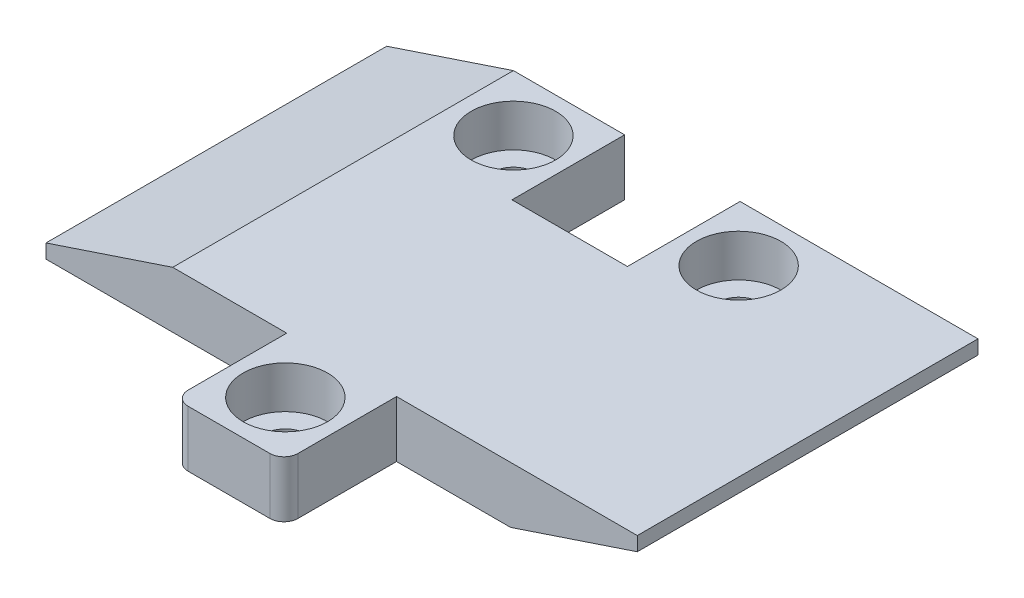
ISO-10303-21;
HEADER;
FILE_DESCRIPTION(('STEP AP214'),'2;1');
FILE_NAME('part.step','',(''),(''),'','','');
FILE_SCHEMA(('AUTOMOTIVE_DESIGN { 1 0 10303 214 1 1 1 1 }'));
ENDSEC;
DATA;
#1=APPLICATION_CONTEXT('core data for automotive mechanical design processes');
#2=APPLICATION_PROTOCOL_DEFINITION('international standard','automotive_design',2000,#1);
#3=PRODUCT_CONTEXT('',#1,'mechanical');
#4=PRODUCT('Part','Part','',(#3));
#5=PRODUCT_RELATED_PRODUCT_CATEGORY('part','',(#4));
#6=PRODUCT_DEFINITION_FORMATION('','',#4);
#7=PRODUCT_DEFINITION_CONTEXT('part definition',#1,'design');
#8=PRODUCT_DEFINITION('design','',#6,#7);
#9=PRODUCT_DEFINITION_SHAPE('','',#8);
#10=(LENGTH_UNIT() NAMED_UNIT(*) SI_UNIT(.MILLI.,.METRE.));
#11=(NAMED_UNIT(*) PLANE_ANGLE_UNIT() SI_UNIT($,.RADIAN.));
#12=(NAMED_UNIT(*) SI_UNIT($,.STERADIAN.) SOLID_ANGLE_UNIT());
#13=UNCERTAINTY_MEASURE_WITH_UNIT(LENGTH_MEASURE(1.E-05),#10,'distance_accuracy_value','');
#14=(GEOMETRIC_REPRESENTATION_CONTEXT(3) GLOBAL_UNCERTAINTY_ASSIGNED_CONTEXT((#13)) GLOBAL_UNIT_ASSIGNED_CONTEXT((#10,
#11,#12)) REPRESENTATION_CONTEXT('',''));
#15=CARTESIAN_POINT('',(0.,0.,0.));
#16=DIRECTION('',(0.,0.,1.));
#17=DIRECTION('',(1.,0.,0.));
#18=AXIS2_PLACEMENT_3D('',#15,#16,#17);
#19=CARTESIAN_POINT('',(0.,4.,12.1));
#20=DIRECTION('',(0.,-1.,0.));
#21=DIRECTION('',(0.,0.,-1.));
#22=AXIS2_PLACEMENT_3D('',#19,#20,#21);
#23=CYLINDRICAL_SURFACE('',#22,1.5);
#24=CARTESIAN_POINT('',(0.,0.,12.1));
#25=DIRECTION('',(0.,1.,0.));
#26=DIRECTION('',(0.,0.,1.));
#27=AXIS2_PLACEMENT_3D('',#24,#25,#26);
#28=CIRCLE('',#27,1.5);
#29=CARTESIAN_POINT('',(0.,0.,13.6));
#30=VERTEX_POINT('',#29);
#31=EDGE_CURVE('E259',#30,#30,#28,.T.);
#32=ORIENTED_EDGE('',*,*,#31,.F.);
#33=EDGE_LOOP('',(#32));
#34=FACE_BOUND('',#33,.T.);
#35=CARTESIAN_POINT('',(0.,1.,12.1));
#36=DIRECTION('',(0.,1.,0.));
#37=DIRECTION('',(0.,0.,1.));
#38=AXIS2_PLACEMENT_3D('',#35,#36,#37);
#39=CIRCLE('',#38,1.5);
#40=CARTESIAN_POINT('',(0.,1.,13.6));
#41=VERTEX_POINT('',#40);
#42=EDGE_CURVE('E256',#41,#41,#39,.T.);
#43=ORIENTED_EDGE('',*,*,#42,.T.);
#44=EDGE_LOOP('',(#43));
#45=FACE_BOUND('',#44,.T.);
#46=ADVANCED_FACE('F42',(#34,#45),#23,.F.);
#47=CARTESIAN_POINT('',(8.,4.,-12.1));
#48=DIRECTION('',(0.,-1.,0.));
#49=DIRECTION('',(0.,0.,-1.));
#50=AXIS2_PLACEMENT_3D('',#47,#48,#49);
#51=CYLINDRICAL_SURFACE('',#50,1.5);
#52=CARTESIAN_POINT('',(8.,0.,-12.1));
#53=DIRECTION('',(0.,1.,0.));
#54=DIRECTION('',(0.,0.,1.));
#55=AXIS2_PLACEMENT_3D('',#52,#53,#54);
#56=CIRCLE('',#55,1.5);
#57=CARTESIAN_POINT('',(8.,0.,-10.6));
#58=VERTEX_POINT('',#57);
#59=EDGE_CURVE('E348',#58,#58,#56,.T.);
#60=ORIENTED_EDGE('',*,*,#59,.F.);
#61=EDGE_LOOP('',(#60));
#62=FACE_BOUND('',#61,.T.);
#63=CARTESIAN_POINT('',(8.,1.,-12.1));
#64=DIRECTION('',(0.,1.,0.));
#65=DIRECTION('',(0.,0.,1.));
#66=AXIS2_PLACEMENT_3D('',#63,#64,#65);
#67=CIRCLE('',#66,1.5);
#68=CARTESIAN_POINT('',(8.,1.,-10.6));
#69=VERTEX_POINT('',#68);
#70=EDGE_CURVE('E251',#69,#69,#67,.T.);
#71=ORIENTED_EDGE('',*,*,#70,.T.);
#72=EDGE_LOOP('',(#71));
#73=FACE_BOUND('',#72,.T.);
#74=ADVANCED_FACE('F436',(#62,#73),#51,.F.);
#75=CARTESIAN_POINT('',(-8.,4.,-12.1));
#76=DIRECTION('',(0.,-1.,0.));
#77=DIRECTION('',(0.,0.,-1.));
#78=AXIS2_PLACEMENT_3D('',#75,#76,#77);
#79=CYLINDRICAL_SURFACE('',#78,1.5);
#80=CARTESIAN_POINT('',(-8.,0.,-12.1));
#81=DIRECTION('',(0.,1.,0.));
#82=DIRECTION('',(0.,0.,1.));
#83=AXIS2_PLACEMENT_3D('',#80,#81,#82);
#84=CIRCLE('',#83,1.5);
#85=CARTESIAN_POINT('',(-8.,0.,-10.6));
#86=VERTEX_POINT('',#85);
#87=EDGE_CURVE('E317',#86,#86,#84,.T.);
#88=ORIENTED_EDGE('',*,*,#87,.F.);
#89=EDGE_LOOP('',(#88));
#90=FACE_BOUND('',#89,.T.);
#91=CARTESIAN_POINT('',(-8.,1.,-12.1));
#92=DIRECTION('',(0.,1.,0.));
#93=DIRECTION('',(0.,0.,1.));
#94=AXIS2_PLACEMENT_3D('',#91,#92,#93);
#95=CIRCLE('',#94,1.5);
#96=CARTESIAN_POINT('',(-8.,1.,-10.6));
#97=VERTEX_POINT('',#96);
#98=EDGE_CURVE('E247',#97,#97,#95,.T.);
#99=ORIENTED_EDGE('',*,*,#98,.T.);
#100=EDGE_LOOP('',(#99));
#101=FACE_BOUND('',#100,.T.);
#102=ADVANCED_FACE('F442',(#90,#101),#79,.F.);
#103=CARTESIAN_POINT('',(-21.,4.,8.1));
#104=DIRECTION('',(1.,0.,0.));
#105=DIRECTION('',(0.,0.,-1.));
#106=AXIS2_PLACEMENT_3D('',#103,#104,#105);
#107=PLANE('',#106);
#108=DIRECTION('',(0.,-1.,0.));
#109=VECTOR('',#108,1.);
#110=CARTESIAN_POINT('',(-21.,4.,8.1));
#111=LINE('',#110,#109);
#112=CARTESIAN_POINT('',(-21.,1.,8.1));
#113=VERTEX_POINT('',#112);
#114=CARTESIAN_POINT('',(-21.,0.,8.1));
#115=VERTEX_POINT('',#114);
#116=EDGE_CURVE('E170',#113,#115,#111,.T.);
#117=ORIENTED_EDGE('',*,*,#116,.F.);
#118=DIRECTION('',(0.,0.,-1.));
#119=VECTOR('',#118,1.);
#120=CARTESIAN_POINT('',(-21.,1.,16.1));
#121=LINE('',#120,#119);
#122=CARTESIAN_POINT('',(-21.,1.,-16.1));
#123=VERTEX_POINT('',#122);
#124=EDGE_CURVE('E386',#113,#123,#121,.T.);
#125=ORIENTED_EDGE('',*,*,#124,.T.);
#126=DIRECTION('',(0.,-1.,0.));
#127=VECTOR('',#126,1.);
#128=CARTESIAN_POINT('',(-21.,4.,-16.1));
#129=LINE('',#128,#127);
#130=CARTESIAN_POINT('',(-21.,0.,-16.1));
#131=VERTEX_POINT('',#130);
#132=EDGE_CURVE('E212',#123,#131,#129,.T.);
#133=ORIENTED_EDGE('',*,*,#132,.T.);
#134=DIRECTION('',(0.,0.,1.));
#135=VECTOR('',#134,1.);
#136=CARTESIAN_POINT('',(-21.,0.,8.1));
#137=LINE('',#136,#135);
#138=EDGE_CURVE('E313',#131,#115,#137,.T.);
#139=ORIENTED_EDGE('',*,*,#138,.T.);
#140=EDGE_LOOP('',(#117,#125,#133,#139));
#141=FACE_BOUND('',#140,.T.);
#142=ADVANCED_FACE('F420',(#141),#107,.F.);
#143=CARTESIAN_POINT('',(-3.9,4.,8.1));
#144=DIRECTION('',(0.,0.,-1.));
#145=DIRECTION('',(-1.,0.,0.));
#146=AXIS2_PLACEMENT_3D('',#143,#144,#145);
#147=PLANE('',#146);
#148=DIRECTION('',(1.,0.,0.));
#149=VECTOR('',#148,1.);
#150=CARTESIAN_POINT('',(-3.9,4.,8.1));
#151=LINE('',#150,#149);
#152=CARTESIAN_POINT('',(-12.,4.,8.1));
#153=VERTEX_POINT('',#152);
#154=CARTESIAN_POINT('',(-3.9,4.,8.1));
#155=VERTEX_POINT('',#154);
#156=EDGE_CURVE('E211',#153,#155,#151,.T.);
#157=ORIENTED_EDGE('',*,*,#156,.F.);
#158=DIRECTION('',(-0.948683298050514,-0.316227766016838,0.));
#159=VECTOR('',#158,1.);
#160=CARTESIAN_POINT('',(-4.71,6.43,8.1));
#161=LINE('',#160,#159);
#162=EDGE_CURVE('E360',#153,#113,#161,.T.);
#163=ORIENTED_EDGE('',*,*,#162,.T.);
#164=ORIENTED_EDGE('',*,*,#116,.T.);
#165=DIRECTION('',(1.,0.,0.));
#166=VECTOR('',#165,1.);
#167=CARTESIAN_POINT('',(-3.9,0.,8.1));
#168=LINE('',#167,#166);
#169=CARTESIAN_POINT('',(-3.9,0.,8.1));
#170=VERTEX_POINT('',#169);
#171=EDGE_CURVE('E308',#115,#170,#168,.T.);
#172=ORIENTED_EDGE('',*,*,#171,.T.);
#173=DIRECTION('',(0.,-1.,0.));
#174=VECTOR('',#173,1.);
#175=CARTESIAN_POINT('',(-3.9,4.,8.1));
#176=LINE('',#175,#174);
#177=EDGE_CURVE('E241',#155,#170,#176,.T.);
#178=ORIENTED_EDGE('',*,*,#177,.F.);
#179=EDGE_LOOP('',(#157,#163,#164,#172,#178));
#180=FACE_BOUND('',#179,.T.);
#181=ADVANCED_FACE('F425',(#180),#147,.F.);
#182=CARTESIAN_POINT('',(-3.9,4.,16.1));
#183=DIRECTION('',(1.,0.,0.));
#184=DIRECTION('',(0.,0.,-1.));
#185=AXIS2_PLACEMENT_3D('',#182,#183,#184);
#186=PLANE('',#185);
#187=DIRECTION('',(0.,0.,1.));
#188=VECTOR('',#187,1.);
#189=CARTESIAN_POINT('',(-3.9,0.,16.1));
#190=LINE('',#189,#188);
#191=CARTESIAN_POINT('',(-3.9,0.,15.1));
#192=VERTEX_POINT('',#191);
#193=EDGE_CURVE('E304',#170,#192,#190,.T.);
#194=ORIENTED_EDGE('',*,*,#193,.T.);
#195=DIRECTION('',(0.,-1.,0.));
#196=VECTOR('',#195,1.);
#197=CARTESIAN_POINT('',(-3.9,4.,15.1));
#198=LINE('',#197,#196);
#199=CARTESIAN_POINT('',(-3.9,4.,15.1));
#200=VERTEX_POINT('',#199);
#201=EDGE_CURVE('E11',#192,#200,#198,.F.);
#202=ORIENTED_EDGE('',*,*,#201,.T.);
#203=DIRECTION('',(0.,0.,1.));
#204=VECTOR('',#203,1.);
#205=CARTESIAN_POINT('',(-3.9,4.,16.1));
#206=LINE('',#205,#204);
#207=EDGE_CURVE('E340',#155,#200,#206,.T.);
#208=ORIENTED_EDGE('',*,*,#207,.F.);
#209=ORIENTED_EDGE('',*,*,#177,.T.);
#210=EDGE_LOOP('',(#194,#202,#208,#209));
#211=FACE_BOUND('',#210,.T.);
#212=ADVANCED_FACE('F428',(#211),#186,.F.);
#213=CARTESIAN_POINT('',(3.9,4.,16.1));
#214=DIRECTION('',(0.,0.,-1.));
#215=DIRECTION('',(-1.,0.,0.));
#216=AXIS2_PLACEMENT_3D('',#213,#214,#215);
#217=PLANE('',#216);
#218=DIRECTION('',(1.,0.,0.));
#219=VECTOR('',#218,1.);
#220=CARTESIAN_POINT('',(3.9,0.,16.1));
#221=LINE('',#220,#219);
#222=CARTESIAN_POINT('',(-2.9,0.,16.1));
#223=VERTEX_POINT('',#222);
#224=CARTESIAN_POINT('',(2.9,0.,16.1));
#225=VERTEX_POINT('',#224);
#226=EDGE_CURVE('E300',#223,#225,#221,.T.);
#227=ORIENTED_EDGE('',*,*,#226,.T.);
#228=DIRECTION('',(0.,-1.,0.));
#229=VECTOR('',#228,1.);
#230=CARTESIAN_POINT('',(2.9,4.,16.1));
#231=LINE('',#230,#229);
#232=CARTESIAN_POINT('',(2.9,4.,16.1));
#233=VERTEX_POINT('',#232);
#234=EDGE_CURVE('E64',#225,#233,#231,.F.);
#235=ORIENTED_EDGE('',*,*,#234,.T.);
#236=DIRECTION('',(1.,0.,0.));
#237=VECTOR('',#236,1.);
#238=CARTESIAN_POINT('',(3.9,4.,16.1));
#239=LINE('',#238,#237);
#240=CARTESIAN_POINT('',(-2.9,4.,16.1));
#241=VERTEX_POINT('',#240);
#242=EDGE_CURVE('E289',#241,#233,#239,.T.);
#243=ORIENTED_EDGE('',*,*,#242,.F.);
#244=DIRECTION('',(0.,-1.,0.));
#245=VECTOR('',#244,1.);
#246=CARTESIAN_POINT('',(-2.9,4.,16.1));
#247=LINE('',#246,#245);
#248=EDGE_CURVE('E274',#241,#223,#247,.T.);
#249=ORIENTED_EDGE('',*,*,#248,.T.);
#250=EDGE_LOOP('',(#227,#235,#243,#249));
#251=FACE_BOUND('',#250,.T.);
#252=ADVANCED_FACE('F301',(#251),#217,.F.);
#253=CARTESIAN_POINT('',(3.9,4.,8.1));
#254=DIRECTION('',(-1.,0.,0.));
#255=DIRECTION('',(0.,0.,1.));
#256=AXIS2_PLACEMENT_3D('',#253,#254,#255);
#257=PLANE('',#256);
#258=DIRECTION('',(0.,0.,-1.));
#259=VECTOR('',#258,1.);
#260=CARTESIAN_POINT('',(3.9,4.,8.1));
#261=LINE('',#260,#259);
#262=CARTESIAN_POINT('',(3.9,4.,15.1));
#263=VERTEX_POINT('',#262);
#264=CARTESIAN_POINT('',(3.9,4.,8.1));
#265=VERTEX_POINT('',#264);
#266=EDGE_CURVE('E287',#263,#265,#261,.T.);
#267=ORIENTED_EDGE('',*,*,#266,.F.);
#268=DIRECTION('',(0.,-1.,0.));
#269=VECTOR('',#268,1.);
#270=CARTESIAN_POINT('',(3.9,4.,15.1));
#271=LINE('',#270,#269);
#272=CARTESIAN_POINT('',(3.9,0.,15.1));
#273=VERTEX_POINT('',#272);
#274=EDGE_CURVE('E264',#263,#273,#271,.T.);
#275=ORIENTED_EDGE('',*,*,#274,.T.);
#276=DIRECTION('',(0.,0.,-1.));
#277=VECTOR('',#276,1.);
#278=CARTESIAN_POINT('',(3.9,0.,8.1));
#279=LINE('',#278,#277);
#280=CARTESIAN_POINT('',(3.9,0.,8.1));
#281=VERTEX_POINT('',#280);
#282=EDGE_CURVE('E198',#273,#281,#279,.T.);
#283=ORIENTED_EDGE('',*,*,#282,.T.);
#284=DIRECTION('',(0.,-1.,0.));
#285=VECTOR('',#284,1.);
#286=CARTESIAN_POINT('',(3.9,4.,8.1));
#287=LINE('',#286,#285);
#288=EDGE_CURVE('E237',#265,#281,#287,.T.);
#289=ORIENTED_EDGE('',*,*,#288,.F.);
#290=EDGE_LOOP('',(#267,#275,#283,#289));
#291=FACE_BOUND('',#290,.T.);
#292=ADVANCED_FACE('F293',(#291),#257,.F.);
#293=CARTESIAN_POINT('',(21.,4.,8.1));
#294=DIRECTION('',(0.,0.,-1.));
#295=DIRECTION('',(-1.,0.,0.));
#296=AXIS2_PLACEMENT_3D('',#293,#294,#295);
#297=PLANE('',#296);
#298=DIRECTION('',(1.,0.,0.));
#299=VECTOR('',#298,1.);
#300=CARTESIAN_POINT('',(21.,0.,8.1));
#301=LINE('',#300,#299);
#302=CARTESIAN_POINT('',(12.,0.,8.1));
#303=VERTEX_POINT('',#302);
#304=EDGE_CURVE('E192',#281,#303,#301,.T.);
#305=ORIENTED_EDGE('',*,*,#304,.T.);
#306=DIRECTION('',(0.948683298050514,0.316227766016838,0.));
#307=VECTOR('',#306,1.);
#308=CARTESIAN_POINT('',(21.3,3.1,8.1));
#309=LINE('',#308,#307);
#310=CARTESIAN_POINT('',(21.,3.,8.1));
#311=VERTEX_POINT('',#310);
#312=EDGE_CURVE('E163',#303,#311,#309,.T.);
#313=ORIENTED_EDGE('',*,*,#312,.T.);
#314=DIRECTION('',(0.,-1.,0.));
#315=VECTOR('',#314,1.);
#316=CARTESIAN_POINT('',(21.,4.,8.1));
#317=LINE('',#316,#315);
#318=CARTESIAN_POINT('',(21.,4.,8.1));
#319=VERTEX_POINT('',#318);
#320=EDGE_CURVE('E233',#319,#311,#317,.T.);
#321=ORIENTED_EDGE('',*,*,#320,.F.);
#322=DIRECTION('',(1.,0.,0.));
#323=VECTOR('',#322,1.);
#324=CARTESIAN_POINT('',(21.,4.,8.1));
#325=LINE('',#324,#323);
#326=EDGE_CURVE('E296',#265,#319,#325,.T.);
#327=ORIENTED_EDGE('',*,*,#326,.F.);
#328=ORIENTED_EDGE('',*,*,#288,.T.);
#329=EDGE_LOOP('',(#305,#313,#321,#327,#328));
#330=FACE_BOUND('',#329,.T.);
#331=ADVANCED_FACE('F396',(#330),#297,.F.);
#332=CARTESIAN_POINT('',(21.,4.,-16.1));
#333=DIRECTION('',(-1.,0.,0.));
#334=DIRECTION('',(0.,0.,1.));
#335=AXIS2_PLACEMENT_3D('',#332,#333,#334);
#336=PLANE('',#335);
#337=ORIENTED_EDGE('',*,*,#320,.T.);
#338=DIRECTION('',(0.,0.,-1.));
#339=VECTOR('',#338,1.);
#340=CARTESIAN_POINT('',(21.,3.,16.1));
#341=LINE('',#340,#339);
#342=CARTESIAN_POINT('',(21.,3.,-16.1));
#343=VERTEX_POINT('',#342);
#344=EDGE_CURVE('E182',#311,#343,#341,.T.);
#345=ORIENTED_EDGE('',*,*,#344,.T.);
#346=DIRECTION('',(0.,-1.,0.));
#347=VECTOR('',#346,1.);
#348=CARTESIAN_POINT('',(21.,4.,-16.1));
#349=LINE('',#348,#347);
#350=CARTESIAN_POINT('',(21.,4.,-16.1));
#351=VERTEX_POINT('',#350);
#352=EDGE_CURVE('E180',#351,#343,#349,.T.);
#353=ORIENTED_EDGE('',*,*,#352,.F.);
#354=DIRECTION('',(0.,0.,-1.));
#355=VECTOR('',#354,1.);
#356=CARTESIAN_POINT('',(21.,4.,-16.1));
#357=LINE('',#356,#355);
#358=EDGE_CURVE('E333',#319,#351,#357,.T.);
#359=ORIENTED_EDGE('',*,*,#358,.F.);
#360=EDGE_LOOP('',(#337,#345,#353,#359));
#361=FACE_BOUND('',#360,.T.);
#362=ADVANCED_FACE('F392',(#361),#336,.F.);
#363=CARTESIAN_POINT('',(4.1,4.,-16.1));
#364=DIRECTION('',(0.,0.,1.));
#365=DIRECTION('',(1.,0.,0.));
#366=AXIS2_PLACEMENT_3D('',#363,#364,#365);
#367=PLANE('',#366);
#368=ORIENTED_EDGE('',*,*,#352,.T.);
#369=DIRECTION('',(0.948683298050514,0.316227766016838,0.));
#370=VECTOR('',#369,1.);
#371=CARTESIAN_POINT('',(21.,3.,-16.1));
#372=LINE('',#371,#370);
#373=CARTESIAN_POINT('',(12.,0.,-16.1));
#374=VERTEX_POINT('',#373);
#375=EDGE_CURVE('E160',#374,#343,#372,.T.);
#376=ORIENTED_EDGE('',*,*,#375,.F.);
#377=DIRECTION('',(-1.,0.,0.));
#378=VECTOR('',#377,1.);
#379=CARTESIAN_POINT('',(4.1,0.,-16.1));
#380=LINE('',#379,#378);
#381=CARTESIAN_POINT('',(4.1,0.,-16.1));
#382=VERTEX_POINT('',#381);
#383=EDGE_CURVE('E176',#374,#382,#380,.T.);
#384=ORIENTED_EDGE('',*,*,#383,.T.);
#385=DIRECTION('',(0.,-1.,0.));
#386=VECTOR('',#385,1.);
#387=CARTESIAN_POINT('',(4.1,4.,-16.1));
#388=LINE('',#387,#386);
#389=CARTESIAN_POINT('',(4.1,4.,-16.1));
#390=VERTEX_POINT('',#389);
#391=EDGE_CURVE('E228',#390,#382,#388,.T.);
#392=ORIENTED_EDGE('',*,*,#391,.F.);
#393=DIRECTION('',(-1.,0.,0.));
#394=VECTOR('',#393,1.);
#395=CARTESIAN_POINT('',(4.1,4.,-16.1));
#396=LINE('',#395,#394);
#397=EDGE_CURVE('E330',#351,#390,#396,.T.);
#398=ORIENTED_EDGE('',*,*,#397,.F.);
#399=EDGE_LOOP('',(#368,#376,#384,#392,#398));
#400=FACE_BOUND('',#399,.T.);
#401=ADVANCED_FACE('F174',(#400),#367,.F.);
#402=CARTESIAN_POINT('',(4.1,4.,-8.1));
#403=DIRECTION('',(1.,0.,0.));
#404=DIRECTION('',(0.,0.,-1.));
#405=AXIS2_PLACEMENT_3D('',#402,#403,#404);
#406=PLANE('',#405);
#407=DIRECTION('',(0.,0.,1.));
#408=VECTOR('',#407,1.);
#409=CARTESIAN_POINT('',(4.1,0.,-8.1));
#410=LINE('',#409,#408);
#411=CARTESIAN_POINT('',(4.1,0.,-8.1));
#412=VERTEX_POINT('',#411);
#413=EDGE_CURVE('E190',#382,#412,#410,.T.);
#414=ORIENTED_EDGE('',*,*,#413,.T.);
#415=DIRECTION('',(0.,-1.,0.));
#416=VECTOR('',#415,1.);
#417=CARTESIAN_POINT('',(4.1,4.,-8.1));
#418=LINE('',#417,#416);
#419=CARTESIAN_POINT('',(4.1,4.,-8.1));
#420=VERTEX_POINT('',#419);
#421=EDGE_CURVE('E224',#420,#412,#418,.T.);
#422=ORIENTED_EDGE('',*,*,#421,.F.);
#423=DIRECTION('',(0.,0.,1.));
#424=VECTOR('',#423,1.);
#425=CARTESIAN_POINT('',(4.1,4.,-8.1));
#426=LINE('',#425,#424);
#427=EDGE_CURVE('E327',#390,#420,#426,.T.);
#428=ORIENTED_EDGE('',*,*,#427,.F.);
#429=ORIENTED_EDGE('',*,*,#391,.T.);
#430=EDGE_LOOP('',(#414,#422,#428,#429));
#431=FACE_BOUND('',#430,.T.);
#432=ADVANCED_FACE('F400',(#431),#406,.F.);
#433=CARTESIAN_POINT('',(-4.1,4.,-8.1));
#434=DIRECTION('',(0.,0.,1.));
#435=DIRECTION('',(1.,0.,0.));
#436=AXIS2_PLACEMENT_3D('',#433,#434,#435);
#437=PLANE('',#436);
#438=DIRECTION('',(-1.,0.,0.));
#439=VECTOR('',#438,1.);
#440=CARTESIAN_POINT('',(-4.1,0.,-8.1));
#441=LINE('',#440,#439);
#442=CARTESIAN_POINT('',(-4.1,0.,-8.1));
#443=VERTEX_POINT('',#442);
#444=EDGE_CURVE('E196',#412,#443,#441,.T.);
#445=ORIENTED_EDGE('',*,*,#444,.T.);
#446=DIRECTION('',(0.,-1.,0.));
#447=VECTOR('',#446,1.);
#448=CARTESIAN_POINT('',(-4.1,4.,-8.1));
#449=LINE('',#448,#447);
#450=CARTESIAN_POINT('',(-4.1,4.,-8.1));
#451=VERTEX_POINT('',#450);
#452=EDGE_CURVE('E220',#451,#443,#449,.T.);
#453=ORIENTED_EDGE('',*,*,#452,.F.);
#454=DIRECTION('',(-1.,0.,0.));
#455=VECTOR('',#454,1.);
#456=CARTESIAN_POINT('',(-4.1,4.,-8.1));
#457=LINE('',#456,#455);
#458=EDGE_CURVE('E324',#420,#451,#457,.T.);
#459=ORIENTED_EDGE('',*,*,#458,.F.);
#460=ORIENTED_EDGE('',*,*,#421,.T.);
#461=EDGE_LOOP('',(#445,#453,#459,#460));
#462=FACE_BOUND('',#461,.T.);
#463=ADVANCED_FACE('F404',(#462),#437,.F.);
#464=CARTESIAN_POINT('',(-4.1,4.,-16.1));
#465=DIRECTION('',(-1.,0.,0.));
#466=DIRECTION('',(0.,0.,1.));
#467=AXIS2_PLACEMENT_3D('',#464,#465,#466);
#468=PLANE('',#467);
#469=DIRECTION('',(0.,0.,-1.));
#470=VECTOR('',#469,1.);
#471=CARTESIAN_POINT('',(-4.1,0.,-16.1));
#472=LINE('',#471,#470);
#473=CARTESIAN_POINT('',(-4.1,0.,-16.1));
#474=VERTEX_POINT('',#473);
#475=EDGE_CURVE('E204',#443,#474,#472,.T.);
#476=ORIENTED_EDGE('',*,*,#475,.T.);
#477=DIRECTION('',(0.,-1.,0.));
#478=VECTOR('',#477,1.);
#479=CARTESIAN_POINT('',(-4.1,4.,-16.1));
#480=LINE('',#479,#478);
#481=CARTESIAN_POINT('',(-4.1,4.,-16.1));
#482=VERTEX_POINT('',#481);
#483=EDGE_CURVE('E215',#482,#474,#480,.T.);
#484=ORIENTED_EDGE('',*,*,#483,.F.);
#485=DIRECTION('',(0.,0.,-1.));
#486=VECTOR('',#485,1.);
#487=CARTESIAN_POINT('',(-4.1,4.,-16.1));
#488=LINE('',#487,#486);
#489=EDGE_CURVE('E321',#451,#482,#488,.T.);
#490=ORIENTED_EDGE('',*,*,#489,.F.);
#491=ORIENTED_EDGE('',*,*,#452,.T.);
#492=EDGE_LOOP('',(#476,#484,#490,#491));
#493=FACE_BOUND('',#492,.T.);
#494=ADVANCED_FACE('F409',(#493),#468,.F.);
#495=CARTESIAN_POINT('',(-21.,4.,-16.1));
#496=DIRECTION('',(0.,0.,1.));
#497=DIRECTION('',(1.,0.,0.));
#498=AXIS2_PLACEMENT_3D('',#495,#496,#497);
#499=PLANE('',#498);
#500=ORIENTED_EDGE('',*,*,#132,.F.);
#501=DIRECTION('',(-0.948683298050514,-0.316227766016838,0.));
#502=VECTOR('',#501,1.);
#503=CARTESIAN_POINT('',(-12.,4.,-16.1));
#504=LINE('',#503,#502);
#505=CARTESIAN_POINT('',(-12.,4.,-16.1));
#506=VERTEX_POINT('',#505);
#507=EDGE_CURVE('E183',#506,#123,#504,.T.);
#508=ORIENTED_EDGE('',*,*,#507,.F.);
#509=DIRECTION('',(-1.,0.,0.));
#510=VECTOR('',#509,1.);
#511=CARTESIAN_POINT('',(-21.,4.,-16.1));
#512=LINE('',#511,#510);
#513=EDGE_CURVE('E216',#482,#506,#512,.T.);
#514=ORIENTED_EDGE('',*,*,#513,.F.);
#515=ORIENTED_EDGE('',*,*,#483,.T.);
#516=DIRECTION('',(-1.,0.,0.));
#517=VECTOR('',#516,1.);
#518=CARTESIAN_POINT('',(-21.,0.,-16.1));
#519=LINE('',#518,#517);
#520=EDGE_CURVE('E207',#474,#131,#519,.T.);
#521=ORIENTED_EDGE('',*,*,#520,.T.);
#522=EDGE_LOOP('',(#500,#508,#514,#515,#521));
#523=FACE_BOUND('',#522,.T.);
#524=ADVANCED_FACE('F415',(#523),#499,.F.);
#525=CARTESIAN_POINT('',(0.,4.,0.));
#526=DIRECTION('',(0.,-1.,0.));
#527=DIRECTION('',(0.,0.,-1.));
#528=AXIS2_PLACEMENT_3D('',#525,#526,#527);
#529=PLANE('',#528);
#530=CARTESIAN_POINT('',(-8.,4.,-12.1));
#531=DIRECTION('',(0.,1.,0.));
#532=DIRECTION('',(0.,0.,1.));
#533=AXIS2_PLACEMENT_3D('',#530,#531,#532);
#534=CIRCLE('',#533,3.);
#535=CARTESIAN_POINT('',(-8.,4.,-9.1));
#536=VERTEX_POINT('',#535);
#537=EDGE_CURVE('E372',#536,#536,#534,.T.);
#538=ORIENTED_EDGE('',*,*,#537,.F.);
#539=EDGE_LOOP('',(#538));
#540=FACE_BOUND('',#539,.T.);
#541=CARTESIAN_POINT('',(8.,4.,-12.1));
#542=DIRECTION('',(0.,1.,0.));
#543=DIRECTION('',(0.,0.,1.));
#544=AXIS2_PLACEMENT_3D('',#541,#542,#543);
#545=CIRCLE('',#544,3.);
#546=CARTESIAN_POINT('',(8.,4.,-9.1));
#547=VERTEX_POINT('',#546);
#548=EDGE_CURVE('E368',#547,#547,#545,.T.);
#549=ORIENTED_EDGE('',*,*,#548,.F.);
#550=EDGE_LOOP('',(#549));
#551=FACE_BOUND('',#550,.T.);
#552=CARTESIAN_POINT('',(0.,4.,12.1));
#553=DIRECTION('',(0.,1.,0.));
#554=DIRECTION('',(0.,0.,1.));
#555=AXIS2_PLACEMENT_3D('',#552,#553,#554);
#556=CIRCLE('',#555,3.);
#557=CARTESIAN_POINT('',(0.,4.,15.1));
#558=VERTEX_POINT('',#557);
#559=EDGE_CURVE('E359',#558,#558,#556,.T.);
#560=ORIENTED_EDGE('',*,*,#559,.F.);
#561=EDGE_LOOP('',(#560));
#562=FACE_BOUND('',#561,.T.);
#563=ORIENTED_EDGE('',*,*,#242,.T.);
#564=CARTESIAN_POINT('',(2.9,4.,15.1));
#565=DIRECTION('',(0.,-1.,0.));
#566=DIRECTION('',(0.,0.,-1.));
#567=AXIS2_PLACEMENT_3D('',#564,#565,#566);
#568=CIRCLE('',#567,1.);
#569=EDGE_CURVE('E51',#233,#263,#568,.F.);
#570=ORIENTED_EDGE('',*,*,#569,.T.);
#571=ORIENTED_EDGE('',*,*,#266,.T.);
#572=ORIENTED_EDGE('',*,*,#326,.T.);
#573=ORIENTED_EDGE('',*,*,#358,.T.);
#574=ORIENTED_EDGE('',*,*,#397,.T.);
#575=ORIENTED_EDGE('',*,*,#427,.T.);
#576=ORIENTED_EDGE('',*,*,#458,.T.);
#577=ORIENTED_EDGE('',*,*,#489,.T.);
#578=ORIENTED_EDGE('',*,*,#513,.T.);
#579=DIRECTION('',(0.,0.,1.));
#580=VECTOR('',#579,1.);
#581=CARTESIAN_POINT('',(-12.,4.,0.));
#582=LINE('',#581,#580);
#583=EDGE_CURVE('E169',#506,#153,#582,.T.);
#584=ORIENTED_EDGE('',*,*,#583,.T.);
#585=ORIENTED_EDGE('',*,*,#156,.T.);
#586=ORIENTED_EDGE('',*,*,#207,.T.);
#587=CARTESIAN_POINT('',(-2.9,4.,15.1));
#588=DIRECTION('',(0.,-1.,0.));
#589=DIRECTION('',(0.,0.,-1.));
#590=AXIS2_PLACEMENT_3D('',#587,#588,#589);
#591=CIRCLE('',#590,1.);
#592=EDGE_CURVE('E280',#200,#241,#591,.F.);
#593=ORIENTED_EDGE('',*,*,#592,.T.);
#594=EDGE_LOOP('',(#563,#570,#571,#572,#573,#574,#575,#576,#577,#578,#584,#585,#586,#593));
#595=FACE_BOUND('',#594,.T.);
#596=ADVANCED_FACE('F286',(#540,#551,#562,#595),#529,.F.);
#597=CARTESIAN_POINT('',(0.,0.,0.));
#598=DIRECTION('',(0.,-1.,0.));
#599=DIRECTION('',(0.,0.,-1.));
#600=AXIS2_PLACEMENT_3D('',#597,#598,#599);
#601=PLANE('',#600);
#602=ORIENTED_EDGE('',*,*,#282,.F.);
#603=CARTESIAN_POINT('',(2.9,0.,15.1));
#604=DIRECTION('',(0.,-1.,0.));
#605=DIRECTION('',(0.,0.,-1.));
#606=AXIS2_PLACEMENT_3D('',#603,#604,#605);
#607=CIRCLE('',#606,1.);
#608=EDGE_CURVE('E271',#273,#225,#607,.T.);
#609=ORIENTED_EDGE('',*,*,#608,.T.);
#610=ORIENTED_EDGE('',*,*,#226,.F.);
#611=CARTESIAN_POINT('',(-2.9,0.,15.1));
#612=DIRECTION('',(0.,-1.,0.));
#613=DIRECTION('',(0.,0.,-1.));
#614=AXIS2_PLACEMENT_3D('',#611,#612,#613);
#615=CIRCLE('',#614,1.);
#616=EDGE_CURVE('E268',#223,#192,#615,.T.);
#617=ORIENTED_EDGE('',*,*,#616,.T.);
#618=ORIENTED_EDGE('',*,*,#193,.F.);
#619=ORIENTED_EDGE('',*,*,#171,.F.);
#620=ORIENTED_EDGE('',*,*,#138,.F.);
#621=ORIENTED_EDGE('',*,*,#520,.F.);
#622=ORIENTED_EDGE('',*,*,#475,.F.);
#623=ORIENTED_EDGE('',*,*,#444,.F.);
#624=ORIENTED_EDGE('',*,*,#413,.F.);
#625=ORIENTED_EDGE('',*,*,#383,.F.);
#626=DIRECTION('',(0.,0.,-1.));
#627=VECTOR('',#626,1.);
#628=CARTESIAN_POINT('',(12.,0.,0.));
#629=LINE('',#628,#627);
#630=EDGE_CURVE('E157',#303,#374,#629,.T.);
#631=ORIENTED_EDGE('',*,*,#630,.F.);
#632=ORIENTED_EDGE('',*,*,#304,.F.);
#633=EDGE_LOOP('',(#602,#609,#610,#617,#618,#619,#620,#621,#622,#623,#624,#625,#631,#632));
#634=FACE_BOUND('',#633,.T.);
#635=ORIENTED_EDGE('',*,*,#87,.T.);
#636=EDGE_LOOP('',(#635));
#637=FACE_BOUND('',#636,.T.);
#638=ORIENTED_EDGE('',*,*,#59,.T.);
#639=EDGE_LOOP('',(#638));
#640=FACE_BOUND('',#639,.T.);
#641=ORIENTED_EDGE('',*,*,#31,.T.);
#642=EDGE_LOOP('',(#641));
#643=FACE_BOUND('',#642,.T.);
#644=ADVANCED_FACE('F187',(#634,#637,#640,#643),#601,.T.);
#645=CARTESIAN_POINT('',(-8.,1.,-12.1));
#646=DIRECTION('',(0.,1.,0.));
#647=DIRECTION('',(0.,0.,1.));
#648=AXIS2_PLACEMENT_3D('',#645,#646,#647);
#649=CYLINDRICAL_SURFACE('',#648,3.);
#650=CARTESIAN_POINT('',(-8.,1.,-12.1));
#651=DIRECTION('',(0.,1.,0.));
#652=DIRECTION('',(0.,0.,1.));
#653=AXIS2_PLACEMENT_3D('',#650,#651,#652);
#654=CIRCLE('',#653,3.);
#655=CARTESIAN_POINT('',(-8.,1.,-9.1));
#656=VERTEX_POINT('',#655);
#657=EDGE_CURVE('E252',#656,#656,#654,.T.);
#658=ORIENTED_EDGE('',*,*,#657,.F.);
#659=EDGE_LOOP('',(#658));
#660=FACE_BOUND('',#659,.T.);
#661=ORIENTED_EDGE('',*,*,#537,.T.);
#662=EDGE_LOOP('',(#661));
#663=FACE_BOUND('',#662,.T.);
#664=ADVANCED_FACE('F454',(#660,#663),#649,.F.);
#665=CARTESIAN_POINT('',(-8.,1.,-12.1));
#666=DIRECTION('',(0.,1.,0.));
#667=DIRECTION('',(0.,0.,1.));
#668=AXIS2_PLACEMENT_3D('',#665,#666,#667);
#669=PLANE('',#668);
#670=ORIENTED_EDGE('',*,*,#98,.F.);
#671=EDGE_LOOP('',(#670));
#672=FACE_BOUND('',#671,.T.);
#673=ORIENTED_EDGE('',*,*,#657,.T.);
#674=EDGE_LOOP('',(#673));
#675=FACE_BOUND('',#674,.T.);
#676=ADVANCED_FACE('F502',(#672,#675),#669,.T.);
#677=CARTESIAN_POINT('',(8.,1.,-12.1));
#678=DIRECTION('',(0.,1.,0.));
#679=DIRECTION('',(0.,0.,1.));
#680=AXIS2_PLACEMENT_3D('',#677,#678,#679);
#681=CYLINDRICAL_SURFACE('',#680,3.);
#682=CARTESIAN_POINT('',(8.,1.,-12.1));
#683=DIRECTION('',(0.,1.,0.));
#684=DIRECTION('',(0.,0.,1.));
#685=AXIS2_PLACEMENT_3D('',#682,#683,#684);
#686=CIRCLE('',#685,3.);
#687=CARTESIAN_POINT('',(8.,1.,-9.1));
#688=VERTEX_POINT('',#687);
#689=EDGE_CURVE('E364',#688,#688,#686,.T.);
#690=ORIENTED_EDGE('',*,*,#689,.F.);
#691=EDGE_LOOP('',(#690));
#692=FACE_BOUND('',#691,.T.);
#693=ORIENTED_EDGE('',*,*,#548,.T.);
#694=EDGE_LOOP('',(#693));
#695=FACE_BOUND('',#694,.T.);
#696=ADVANCED_FACE('F498',(#692,#695),#681,.F.);
#697=CARTESIAN_POINT('',(8.,1.,-12.1));
#698=DIRECTION('',(0.,1.,0.));
#699=DIRECTION('',(0.,0.,1.));
#700=AXIS2_PLACEMENT_3D('',#697,#698,#699);
#701=PLANE('',#700);
#702=ORIENTED_EDGE('',*,*,#70,.F.);
#703=EDGE_LOOP('',(#702));
#704=FACE_BOUND('',#703,.T.);
#705=ORIENTED_EDGE('',*,*,#689,.T.);
#706=EDGE_LOOP('',(#705));
#707=FACE_BOUND('',#706,.T.);
#708=ADVANCED_FACE('F494',(#704,#707),#701,.T.);
#709=CARTESIAN_POINT('',(0.,1.,12.1));
#710=DIRECTION('',(0.,1.,0.));
#711=DIRECTION('',(0.,0.,1.));
#712=AXIS2_PLACEMENT_3D('',#709,#710,#711);
#713=CYLINDRICAL_SURFACE('',#712,3.);
#714=CARTESIAN_POINT('',(0.,1.,12.1));
#715=DIRECTION('',(0.,1.,0.));
#716=DIRECTION('',(0.,0.,1.));
#717=AXIS2_PLACEMENT_3D('',#714,#715,#716);
#718=CIRCLE('',#717,3.);
#719=CARTESIAN_POINT('',(0.,1.,15.1));
#720=VERTEX_POINT('',#719);
#721=EDGE_CURVE('E355',#720,#720,#718,.T.);
#722=ORIENTED_EDGE('',*,*,#721,.F.);
#723=EDGE_LOOP('',(#722));
#724=FACE_BOUND('',#723,.T.);
#725=ORIENTED_EDGE('',*,*,#559,.T.);
#726=EDGE_LOOP('',(#725));
#727=FACE_BOUND('',#726,.T.);
#728=ADVANCED_FACE('F490',(#724,#727),#713,.F.);
#729=CARTESIAN_POINT('',(0.,1.,12.1));
#730=DIRECTION('',(0.,1.,0.));
#731=DIRECTION('',(0.,0.,1.));
#732=AXIS2_PLACEMENT_3D('',#729,#730,#731);
#733=PLANE('',#732);
#734=ORIENTED_EDGE('',*,*,#42,.F.);
#735=EDGE_LOOP('',(#734));
#736=FACE_BOUND('',#735,.T.);
#737=ORIENTED_EDGE('',*,*,#721,.T.);
#738=EDGE_LOOP('',(#737));
#739=FACE_BOUND('',#738,.T.);
#740=ADVANCED_FACE('F487',(#736,#739),#733,.T.);
#741=CARTESIAN_POINT('',(21.,3.,16.1));
#742=DIRECTION('',(-0.316227766016838,0.948683298050514,0.));
#743=DIRECTION('',(-0.948683298050514,-0.316227766016838,0.));
#744=AXIS2_PLACEMENT_3D('',#741,#742,#743);
#745=PLANE('',#744);
#746=ORIENTED_EDGE('',*,*,#630,.T.);
#747=ORIENTED_EDGE('',*,*,#375,.T.);
#748=ORIENTED_EDGE('',*,*,#344,.F.);
#749=ORIENTED_EDGE('',*,*,#312,.F.);
#750=EDGE_LOOP('',(#746,#747,#748,#749));
#751=FACE_BOUND('',#750,.T.);
#752=ADVANCED_FACE('F159',(#751),#745,.F.);
#753=CARTESIAN_POINT('',(-12.,4.,16.1));
#754=DIRECTION('',(0.316227766016838,-0.948683298050514,0.));
#755=DIRECTION('',(0.948683298050514,0.316227766016838,0.));
#756=AXIS2_PLACEMENT_3D('',#753,#754,#755);
#757=PLANE('',#756);
#758=ORIENTED_EDGE('',*,*,#583,.F.);
#759=ORIENTED_EDGE('',*,*,#507,.T.);
#760=ORIENTED_EDGE('',*,*,#124,.F.);
#761=ORIENTED_EDGE('',*,*,#162,.F.);
#762=EDGE_LOOP('',(#758,#759,#760,#761));
#763=FACE_BOUND('',#762,.T.);
#764=ADVANCED_FACE('F417',(#763),#757,.F.);
#765=CARTESIAN_POINT('',(2.9,4.,15.1));
#766=DIRECTION('',(0.,-1.,0.));
#767=DIRECTION('',(0.,0.,-1.));
#768=AXIS2_PLACEMENT_3D('',#765,#766,#767);
#769=CYLINDRICAL_SURFACE('',#768,1.);
#770=ORIENTED_EDGE('',*,*,#569,.F.);
#771=ORIENTED_EDGE('',*,*,#234,.F.);
#772=ORIENTED_EDGE('',*,*,#608,.F.);
#773=ORIENTED_EDGE('',*,*,#274,.F.);
#774=EDGE_LOOP('',(#770,#771,#772,#773));
#775=FACE_BOUND('',#774,.T.);
#776=ADVANCED_FACE('F298',(#775),#769,.T.);
#777=CARTESIAN_POINT('',(-2.9,4.,15.1));
#778=DIRECTION('',(0.,-1.,0.));
#779=DIRECTION('',(0.,0.,-1.));
#780=AXIS2_PLACEMENT_3D('',#777,#778,#779);
#781=CYLINDRICAL_SURFACE('',#780,1.);
#782=ORIENTED_EDGE('',*,*,#592,.F.);
#783=ORIENTED_EDGE('',*,*,#201,.F.);
#784=ORIENTED_EDGE('',*,*,#616,.F.);
#785=ORIENTED_EDGE('',*,*,#248,.F.);
#786=EDGE_LOOP('',(#782,#783,#784,#785));
#787=FACE_BOUND('',#786,.T.);
#788=ADVANCED_FACE('F44',(#787),#781,.T.);
#789=CLOSED_SHELL('',(#46,#74,#102,#142,#181,#212,#252,#292,#331,#362,#401,#432,#463,#494,#524,
#596,#644,#664,#676,#696,#708,#728,#740,#752,#764,#776,#788));
#790=MANIFOLD_SOLID_BREP('B2',#789);
#791=ADVANCED_BREP_SHAPE_REPRESENTATION('',(#18,#790),#14);
#792=SHAPE_DEFINITION_REPRESENTATION(#9,#791);
ENDSEC;
END-ISO-10303-21;
